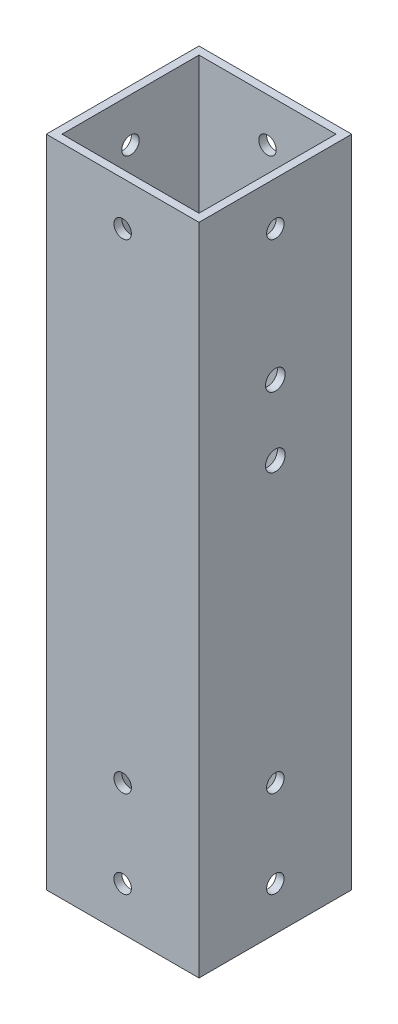
ISO-10303-21;
HEADER;
FILE_DESCRIPTION(('STEP AP214'),'2;1');
FILE_NAME('part.step','',(''),(''),'','','');
FILE_SCHEMA(('AUTOMOTIVE_DESIGN { 1 0 10303 214 1 1 1 1 }'));
ENDSEC;
DATA;
#1=APPLICATION_CONTEXT('core data for automotive mechanical design processes');
#2=APPLICATION_PROTOCOL_DEFINITION('international standard','automotive_design',2000,#1);
#3=PRODUCT_CONTEXT('',#1,'mechanical');
#4=PRODUCT('Part','Part','',(#3));
#5=PRODUCT_RELATED_PRODUCT_CATEGORY('part','',(#4));
#6=PRODUCT_DEFINITION_FORMATION('','',#4);
#7=PRODUCT_DEFINITION_CONTEXT('part definition',#1,'design');
#8=PRODUCT_DEFINITION('design','',#6,#7);
#9=PRODUCT_DEFINITION_SHAPE('','',#8);
#10=(LENGTH_UNIT() NAMED_UNIT(*) SI_UNIT(.MILLI.,.METRE.));
#11=(NAMED_UNIT(*) PLANE_ANGLE_UNIT() SI_UNIT($,.RADIAN.));
#12=(NAMED_UNIT(*) SI_UNIT($,.STERADIAN.) SOLID_ANGLE_UNIT());
#13=UNCERTAINTY_MEASURE_WITH_UNIT(LENGTH_MEASURE(1.E-05),#10,'distance_accuracy_value','');
#14=(GEOMETRIC_REPRESENTATION_CONTEXT(3) GLOBAL_UNCERTAINTY_ASSIGNED_CONTEXT((#13)) GLOBAL_UNIT_ASSIGNED_CONTEXT((#10,
#11,#12)) REPRESENTATION_CONTEXT('',''));
#15=CARTESIAN_POINT('',(0.,0.,0.));
#16=DIRECTION('',(0.,0.,1.));
#17=DIRECTION('',(1.,0.,0.));
#18=AXIS2_PLACEMENT_3D('',#15,#16,#17);
#19=CARTESIAN_POINT('',(-17.5,150.,17.5));
#20=DIRECTION('',(0.,1.,0.));
#21=DIRECTION('',(0.,0.,1.));
#22=AXIS2_PLACEMENT_3D('',#19,#20,#21);
#23=PLANE('',#22);
#24=DIRECTION('',(0.,0.,1.));
#25=VECTOR('',#24,1.);
#26=CARTESIAN_POINT('',(-17.5,150.,-17.5));
#27=LINE('',#26,#25);
#28=CARTESIAN_POINT('',(-17.5,150.,-17.5));
#29=VERTEX_POINT('',#28);
#30=CARTESIAN_POINT('',(-17.5,150.,17.5));
#31=VERTEX_POINT('',#30);
#32=EDGE_CURVE('E137',#29,#31,#27,.T.);
#33=ORIENTED_EDGE('',*,*,#32,.T.);
#34=DIRECTION('',(1.,0.,0.));
#35=VECTOR('',#34,1.);
#36=CARTESIAN_POINT('',(-17.5,150.,17.5));
#37=LINE('',#36,#35);
#38=CARTESIAN_POINT('',(17.5,150.,17.5));
#39=VERTEX_POINT('',#38);
#40=EDGE_CURVE('E140',#31,#39,#37,.T.);
#41=ORIENTED_EDGE('',*,*,#40,.T.);
#42=DIRECTION('',(0.,0.,-1.));
#43=VECTOR('',#42,1.);
#44=CARTESIAN_POINT('',(17.5,150.,-17.5));
#45=LINE('',#44,#43);
#46=CARTESIAN_POINT('',(17.5,150.,-17.5));
#47=VERTEX_POINT('',#46);
#48=EDGE_CURVE('E143',#39,#47,#45,.T.);
#49=ORIENTED_EDGE('',*,*,#48,.T.);
#50=DIRECTION('',(-1.,0.,0.));
#51=VECTOR('',#50,1.);
#52=CARTESIAN_POINT('',(-17.5,150.,-17.5));
#53=LINE('',#52,#51);
#54=EDGE_CURVE('E145',#47,#29,#53,.T.);
#55=ORIENTED_EDGE('',*,*,#54,.T.);
#56=EDGE_LOOP('',(#33,#41,#49,#55));
#57=FACE_BOUND('',#56,.T.);
#58=DIRECTION('',(1.,0.,0.));
#59=VECTOR('',#58,1.);
#60=CARTESIAN_POINT('',(-15.7,150.,15.7));
#61=LINE('',#60,#59);
#62=CARTESIAN_POINT('',(-15.7,150.,15.7));
#63=VERTEX_POINT('',#62);
#64=CARTESIAN_POINT('',(15.7,150.,15.7));
#65=VERTEX_POINT('',#64);
#66=EDGE_CURVE('E107',#63,#65,#61,.T.);
#67=ORIENTED_EDGE('',*,*,#66,.F.);
#68=DIRECTION('',(0.,0.,1.));
#69=VECTOR('',#68,1.);
#70=CARTESIAN_POINT('',(-15.7,150.,-15.7));
#71=LINE('',#70,#69);
#72=CARTESIAN_POINT('',(-15.7,150.,-15.7));
#73=VERTEX_POINT('',#72);
#74=EDGE_CURVE('E99',#73,#63,#71,.T.);
#75=ORIENTED_EDGE('',*,*,#74,.F.);
#76=DIRECTION('',(-1.,0.,0.));
#77=VECTOR('',#76,1.);
#78=CARTESIAN_POINT('',(-15.7,150.,-15.7));
#79=LINE('',#78,#77);
#80=CARTESIAN_POINT('',(15.7,150.,-15.7));
#81=VERTEX_POINT('',#80);
#82=EDGE_CURVE('E121',#81,#73,#79,.T.);
#83=ORIENTED_EDGE('',*,*,#82,.F.);
#84=DIRECTION('',(0.,0.,-1.));
#85=VECTOR('',#84,1.);
#86=CARTESIAN_POINT('',(15.7,150.,-15.7));
#87=LINE('',#86,#85);
#88=EDGE_CURVE('E119',#65,#81,#87,.T.);
#89=ORIENTED_EDGE('',*,*,#88,.F.);
#90=EDGE_LOOP('',(#67,#75,#83,#89));
#91=FACE_BOUND('',#90,.T.);
#92=ADVANCED_FACE('F32',(#57,#91),#23,.T.);
#93=CARTESIAN_POINT('',(-17.5,0.,17.5));
#94=DIRECTION('',(0.,1.,0.));
#95=DIRECTION('',(0.,0.,1.));
#96=AXIS2_PLACEMENT_3D('',#93,#94,#95);
#97=PLANE('',#96);
#98=DIRECTION('',(0.,0.,1.));
#99=VECTOR('',#98,1.);
#100=CARTESIAN_POINT('',(-17.5,0.,-17.5));
#101=LINE('',#100,#99);
#102=CARTESIAN_POINT('',(-17.5,0.,-17.5));
#103=VERTEX_POINT('',#102);
#104=CARTESIAN_POINT('',(-17.5,0.,17.5));
#105=VERTEX_POINT('',#104);
#106=EDGE_CURVE('E115',#103,#105,#101,.T.);
#107=ORIENTED_EDGE('',*,*,#106,.F.);
#108=DIRECTION('',(-1.,0.,0.));
#109=VECTOR('',#108,1.);
#110=CARTESIAN_POINT('',(-17.5,0.,-17.5));
#111=LINE('',#110,#109);
#112=CARTESIAN_POINT('',(17.5,0.,-17.5));
#113=VERTEX_POINT('',#112);
#114=EDGE_CURVE('E141',#113,#103,#111,.T.);
#115=ORIENTED_EDGE('',*,*,#114,.F.);
#116=DIRECTION('',(0.,0.,-1.));
#117=VECTOR('',#116,1.);
#118=CARTESIAN_POINT('',(17.5,0.,-17.5));
#119=LINE('',#118,#117);
#120=CARTESIAN_POINT('',(17.5,0.,17.5));
#121=VERTEX_POINT('',#120);
#122=EDGE_CURVE('E152',#121,#113,#119,.T.);
#123=ORIENTED_EDGE('',*,*,#122,.F.);
#124=DIRECTION('',(1.,0.,0.));
#125=VECTOR('',#124,1.);
#126=CARTESIAN_POINT('',(-17.5,0.,17.5));
#127=LINE('',#126,#125);
#128=EDGE_CURVE('E150',#105,#121,#127,.T.);
#129=ORIENTED_EDGE('',*,*,#128,.F.);
#130=EDGE_LOOP('',(#107,#115,#123,#129));
#131=FACE_BOUND('',#130,.T.);
#132=DIRECTION('',(0.,0.,1.));
#133=VECTOR('',#132,1.);
#134=CARTESIAN_POINT('',(-15.7,0.,-15.7));
#135=LINE('',#134,#133);
#136=CARTESIAN_POINT('',(-15.7,0.,-15.7));
#137=VERTEX_POINT('',#136);
#138=CARTESIAN_POINT('',(-15.7,0.,15.7));
#139=VERTEX_POINT('',#138);
#140=EDGE_CURVE('E57',#137,#139,#135,.T.);
#141=ORIENTED_EDGE('',*,*,#140,.T.);
#142=DIRECTION('',(1.,0.,0.));
#143=VECTOR('',#142,1.);
#144=CARTESIAN_POINT('',(-15.7,0.,15.7));
#145=LINE('',#144,#143);
#146=CARTESIAN_POINT('',(15.7,0.,15.7));
#147=VERTEX_POINT('',#146);
#148=EDGE_CURVE('E114',#139,#147,#145,.T.);
#149=ORIENTED_EDGE('',*,*,#148,.T.);
#150=DIRECTION('',(0.,0.,-1.));
#151=VECTOR('',#150,1.);
#152=CARTESIAN_POINT('',(15.7,0.,-15.7));
#153=LINE('',#152,#151);
#154=CARTESIAN_POINT('',(15.7,0.,-15.7));
#155=VERTEX_POINT('',#154);
#156=EDGE_CURVE('E129',#147,#155,#153,.T.);
#157=ORIENTED_EDGE('',*,*,#156,.T.);
#158=DIRECTION('',(-1.,0.,0.));
#159=VECTOR('',#158,1.);
#160=CARTESIAN_POINT('',(-15.7,0.,-15.7));
#161=LINE('',#160,#159);
#162=EDGE_CURVE('E108',#155,#137,#161,.T.);
#163=ORIENTED_EDGE('',*,*,#162,.T.);
#164=EDGE_LOOP('',(#141,#149,#157,#163));
#165=FACE_BOUND('',#164,.T.);
#166=ADVANCED_FACE('F271',(#131,#165),#97,.F.);
#167=CARTESIAN_POINT('',(-17.5,150.,-17.5));
#168=DIRECTION('',(1.,0.,0.));
#169=DIRECTION('',(0.,0.,-1.));
#170=AXIS2_PLACEMENT_3D('',#167,#168,#169);
#171=PLANE('',#170);
#172=CARTESIAN_POINT('',(-17.5,94.,0.));
#173=DIRECTION('',(1.,0.,0.));
#174=DIRECTION('',(0.,0.,-1.));
#175=AXIS2_PLACEMENT_3D('',#172,#173,#174);
#176=CIRCLE('',#175,2.25);
#177=CARTESIAN_POINT('',(-17.5,94.,-2.25));
#178=VERTEX_POINT('',#177);
#179=EDGE_CURVE('E371',#178,#178,#176,.T.);
#180=ORIENTED_EDGE('',*,*,#179,.T.);
#181=EDGE_LOOP('',(#180));
#182=FACE_BOUND('',#181,.T.);
#183=CARTESIAN_POINT('',(-17.5,110.,0.));
#184=DIRECTION('',(1.,0.,0.));
#185=DIRECTION('',(0.,0.,-1.));
#186=AXIS2_PLACEMENT_3D('',#183,#184,#185);
#187=CIRCLE('',#186,2.25);
#188=CARTESIAN_POINT('',(-17.5,110.,-2.25));
#189=VERTEX_POINT('',#188);
#190=EDGE_CURVE('E193',#189,#189,#187,.T.);
#191=ORIENTED_EDGE('',*,*,#190,.T.);
#192=EDGE_LOOP('',(#191));
#193=FACE_BOUND('',#192,.T.);
#194=CARTESIAN_POINT('',(-17.5,140.,0.));
#195=DIRECTION('',(1.,0.,0.));
#196=DIRECTION('',(0.,0.,-1.));
#197=AXIS2_PLACEMENT_3D('',#194,#195,#196);
#198=CIRCLE('',#197,2.);
#199=CARTESIAN_POINT('',(-17.5,140.,-2.));
#200=VERTEX_POINT('',#199);
#201=EDGE_CURVE('E220',#200,#200,#198,.T.);
#202=ORIENTED_EDGE('',*,*,#201,.T.);
#203=EDGE_LOOP('',(#202));
#204=FACE_BOUND('',#203,.T.);
#205=CARTESIAN_POINT('',(-17.5,30.,0.));
#206=DIRECTION('',(1.,0.,0.));
#207=DIRECTION('',(0.,0.,-1.));
#208=AXIS2_PLACEMENT_3D('',#205,#206,#207);
#209=CIRCLE('',#208,2.);
#210=CARTESIAN_POINT('',(-17.5,30.,-2.));
#211=VERTEX_POINT('',#210);
#212=EDGE_CURVE('E180',#211,#211,#209,.T.);
#213=ORIENTED_EDGE('',*,*,#212,.T.);
#214=EDGE_LOOP('',(#213));
#215=FACE_BOUND('',#214,.T.);
#216=CARTESIAN_POINT('',(-17.5,10.,0.));
#217=DIRECTION('',(1.,0.,0.));
#218=DIRECTION('',(0.,0.,-1.));
#219=AXIS2_PLACEMENT_3D('',#216,#217,#218);
#220=CIRCLE('',#219,2.);
#221=CARTESIAN_POINT('',(-17.5,10.,-2.));
#222=VERTEX_POINT('',#221);
#223=EDGE_CURVE('E175',#222,#222,#220,.T.);
#224=ORIENTED_EDGE('',*,*,#223,.T.);
#225=EDGE_LOOP('',(#224));
#226=FACE_BOUND('',#225,.T.);
#227=ORIENTED_EDGE('',*,*,#106,.T.);
#228=DIRECTION('',(0.,-1.,0.));
#229=VECTOR('',#228,1.);
#230=CARTESIAN_POINT('',(-17.5,150.,17.5));
#231=LINE('',#230,#229);
#232=EDGE_CURVE('E11',#31,#105,#231,.T.);
#233=ORIENTED_EDGE('',*,*,#232,.F.);
#234=ORIENTED_EDGE('',*,*,#32,.F.);
#235=DIRECTION('',(0.,-1.,0.));
#236=VECTOR('',#235,1.);
#237=CARTESIAN_POINT('',(-17.5,150.,-17.5));
#238=LINE('',#237,#236);
#239=EDGE_CURVE('E147',#29,#103,#238,.T.);
#240=ORIENTED_EDGE('',*,*,#239,.T.);
#241=EDGE_LOOP('',(#227,#233,#234,#240));
#242=FACE_BOUND('',#241,.T.);
#243=ADVANCED_FACE('F34',(#182,#193,#204,#215,#226,#242),#171,.F.);
#244=CARTESIAN_POINT('',(-17.5,150.,17.5));
#245=DIRECTION('',(0.,0.,-1.));
#246=DIRECTION('',(-1.,0.,0.));
#247=AXIS2_PLACEMENT_3D('',#244,#245,#246);
#248=PLANE('',#247);
#249=CARTESIAN_POINT('',(0.,140.,17.5));
#250=DIRECTION('',(0.,0.,1.));
#251=DIRECTION('',(1.,0.,0.));
#252=AXIS2_PLACEMENT_3D('',#249,#250,#251);
#253=CIRCLE('',#252,2.);
#254=CARTESIAN_POINT('',(2.,140.,17.5));
#255=VERTEX_POINT('',#254);
#256=EDGE_CURVE('E189',#255,#255,#253,.T.);
#257=ORIENTED_EDGE('',*,*,#256,.F.);
#258=EDGE_LOOP('',(#257));
#259=FACE_BOUND('',#258,.T.);
#260=CARTESIAN_POINT('',(0.,30.,17.5));
#261=DIRECTION('',(0.,0.,1.));
#262=DIRECTION('',(1.,0.,0.));
#263=AXIS2_PLACEMENT_3D('',#260,#261,#262);
#264=CIRCLE('',#263,2.);
#265=CARTESIAN_POINT('',(2.,30.,17.5));
#266=VERTEX_POINT('',#265);
#267=EDGE_CURVE('E237',#266,#266,#264,.T.);
#268=ORIENTED_EDGE('',*,*,#267,.F.);
#269=EDGE_LOOP('',(#268));
#270=FACE_BOUND('',#269,.T.);
#271=CARTESIAN_POINT('',(0.,10.,17.5));
#272=DIRECTION('',(0.,0.,1.));
#273=DIRECTION('',(1.,0.,0.));
#274=AXIS2_PLACEMENT_3D('',#271,#272,#273);
#275=CIRCLE('',#274,2.);
#276=CARTESIAN_POINT('',(2.,10.,17.5));
#277=VERTEX_POINT('',#276);
#278=EDGE_CURVE('E244',#277,#277,#275,.T.);
#279=ORIENTED_EDGE('',*,*,#278,.F.);
#280=EDGE_LOOP('',(#279));
#281=FACE_BOUND('',#280,.T.);
#282=ORIENTED_EDGE('',*,*,#128,.T.);
#283=DIRECTION('',(0.,-1.,0.));
#284=VECTOR('',#283,1.);
#285=CARTESIAN_POINT('',(17.5,150.,17.5));
#286=LINE('',#285,#284);
#287=EDGE_CURVE('E41',#39,#121,#286,.T.);
#288=ORIENTED_EDGE('',*,*,#287,.F.);
#289=ORIENTED_EDGE('',*,*,#40,.F.);
#290=ORIENTED_EDGE('',*,*,#232,.T.);
#291=EDGE_LOOP('',(#282,#288,#289,#290));
#292=FACE_BOUND('',#291,.T.);
#293=ADVANCED_FACE('F285',(#259,#270,#281,#292),#248,.F.);
#294=CARTESIAN_POINT('',(17.5,150.,-17.5));
#295=DIRECTION('',(-1.,0.,0.));
#296=DIRECTION('',(0.,0.,1.));
#297=AXIS2_PLACEMENT_3D('',#294,#295,#296);
#298=PLANE('',#297);
#299=CARTESIAN_POINT('',(17.5,94.,0.));
#300=DIRECTION('',(1.,0.,0.));
#301=DIRECTION('',(0.,0.,-1.));
#302=AXIS2_PLACEMENT_3D('',#299,#300,#301);
#303=CIRCLE('',#302,2.25);
#304=CARTESIAN_POINT('',(17.5,94.,-2.25));
#305=VERTEX_POINT('',#304);
#306=EDGE_CURVE('E370',#305,#305,#303,.T.);
#307=ORIENTED_EDGE('',*,*,#306,.F.);
#308=EDGE_LOOP('',(#307));
#309=FACE_BOUND('',#308,.T.);
#310=CARTESIAN_POINT('',(17.5,110.,0.));
#311=DIRECTION('',(1.,0.,0.));
#312=DIRECTION('',(0.,0.,-1.));
#313=AXIS2_PLACEMENT_3D('',#310,#311,#312);
#314=CIRCLE('',#313,2.25);
#315=CARTESIAN_POINT('',(17.5,110.,-2.25));
#316=VERTEX_POINT('',#315);
#317=EDGE_CURVE('E199',#316,#316,#314,.T.);
#318=ORIENTED_EDGE('',*,*,#317,.F.);
#319=EDGE_LOOP('',(#318));
#320=FACE_BOUND('',#319,.T.);
#321=CARTESIAN_POINT('',(17.5,140.,0.));
#322=DIRECTION('',(1.,0.,0.));
#323=DIRECTION('',(0.,0.,-1.));
#324=AXIS2_PLACEMENT_3D('',#321,#322,#323);
#325=CIRCLE('',#324,2.);
#326=CARTESIAN_POINT('',(17.5,140.,-2.));
#327=VERTEX_POINT('',#326);
#328=EDGE_CURVE('E185',#327,#327,#325,.T.);
#329=ORIENTED_EDGE('',*,*,#328,.F.);
#330=EDGE_LOOP('',(#329));
#331=FACE_BOUND('',#330,.T.);
#332=CARTESIAN_POINT('',(17.5,30.,0.));
#333=DIRECTION('',(1.,0.,0.));
#334=DIRECTION('',(0.,0.,-1.));
#335=AXIS2_PLACEMENT_3D('',#332,#333,#334);
#336=CIRCLE('',#335,2.);
#337=CARTESIAN_POINT('',(17.5,30.,-2.));
#338=VERTEX_POINT('',#337);
#339=EDGE_CURVE('E223',#338,#338,#336,.T.);
#340=ORIENTED_EDGE('',*,*,#339,.F.);
#341=EDGE_LOOP('',(#340));
#342=FACE_BOUND('',#341,.T.);
#343=CARTESIAN_POINT('',(17.5,10.,0.));
#344=DIRECTION('',(1.,0.,0.));
#345=DIRECTION('',(0.,0.,-1.));
#346=AXIS2_PLACEMENT_3D('',#343,#344,#345);
#347=CIRCLE('',#346,2.);
#348=CARTESIAN_POINT('',(17.5,10.,-2.));
#349=VERTEX_POINT('',#348);
#350=EDGE_CURVE('E230',#349,#349,#347,.T.);
#351=ORIENTED_EDGE('',*,*,#350,.F.);
#352=EDGE_LOOP('',(#351));
#353=FACE_BOUND('',#352,.T.);
#354=ORIENTED_EDGE('',*,*,#122,.T.);
#355=DIRECTION('',(0.,-1.,0.));
#356=VECTOR('',#355,1.);
#357=CARTESIAN_POINT('',(17.5,150.,-17.5));
#358=LINE('',#357,#356);
#359=EDGE_CURVE('E157',#47,#113,#358,.T.);
#360=ORIENTED_EDGE('',*,*,#359,.F.);
#361=ORIENTED_EDGE('',*,*,#48,.F.);
#362=ORIENTED_EDGE('',*,*,#287,.T.);
#363=EDGE_LOOP('',(#354,#360,#361,#362));
#364=FACE_BOUND('',#363,.T.);
#365=ADVANCED_FACE('F282',(#309,#320,#331,#342,#353,#364),#298,.F.);
#366=CARTESIAN_POINT('',(-17.5,150.,-17.5));
#367=DIRECTION('',(0.,0.,1.));
#368=DIRECTION('',(1.,0.,0.));
#369=AXIS2_PLACEMENT_3D('',#366,#367,#368);
#370=PLANE('',#369);
#371=CARTESIAN_POINT('',(0.,140.,-17.5));
#372=DIRECTION('',(0.,0.,1.));
#373=DIRECTION('',(1.,0.,0.));
#374=AXIS2_PLACEMENT_3D('',#371,#372,#373);
#375=CIRCLE('',#374,2.);
#376=CARTESIAN_POINT('',(2.,140.,-17.5));
#377=VERTEX_POINT('',#376);
#378=EDGE_CURVE('E213',#377,#377,#375,.T.);
#379=ORIENTED_EDGE('',*,*,#378,.T.);
#380=EDGE_LOOP('',(#379));
#381=FACE_BOUND('',#380,.T.);
#382=CARTESIAN_POINT('',(0.,30.,-17.5));
#383=DIRECTION('',(0.,0.,1.));
#384=DIRECTION('',(1.,0.,0.));
#385=AXIS2_PLACEMENT_3D('',#382,#383,#384);
#386=CIRCLE('',#385,2.);
#387=CARTESIAN_POINT('',(2.,30.,-17.5));
#388=VERTEX_POINT('',#387);
#389=EDGE_CURVE('E170',#388,#388,#386,.T.);
#390=ORIENTED_EDGE('',*,*,#389,.T.);
#391=EDGE_LOOP('',(#390));
#392=FACE_BOUND('',#391,.T.);
#393=CARTESIAN_POINT('',(0.,10.,-17.5));
#394=DIRECTION('',(0.,0.,1.));
#395=DIRECTION('',(1.,0.,0.));
#396=AXIS2_PLACEMENT_3D('',#393,#394,#395);
#397=CIRCLE('',#396,2.);
#398=CARTESIAN_POINT('',(2.,10.,-17.5));
#399=VERTEX_POINT('',#398);
#400=EDGE_CURVE('E165',#399,#399,#397,.T.);
#401=ORIENTED_EDGE('',*,*,#400,.T.);
#402=EDGE_LOOP('',(#401));
#403=FACE_BOUND('',#402,.T.);
#404=ORIENTED_EDGE('',*,*,#114,.T.);
#405=ORIENTED_EDGE('',*,*,#239,.F.);
#406=ORIENTED_EDGE('',*,*,#54,.F.);
#407=ORIENTED_EDGE('',*,*,#359,.T.);
#408=EDGE_LOOP('',(#404,#405,#406,#407));
#409=FACE_BOUND('',#408,.T.);
#410=ADVANCED_FACE('F265',(#381,#392,#403,#409),#370,.F.);
#411=CARTESIAN_POINT('',(-15.7,150.,-15.7));
#412=DIRECTION('',(1.,0.,0.));
#413=DIRECTION('',(0.,0.,-1.));
#414=AXIS2_PLACEMENT_3D('',#411,#412,#413);
#415=PLANE('',#414);
#416=CARTESIAN_POINT('',(-15.7,94.,0.));
#417=DIRECTION('',(1.,0.,0.));
#418=DIRECTION('',(0.,0.,-1.));
#419=AXIS2_PLACEMENT_3D('',#416,#417,#418);
#420=CIRCLE('',#419,2.25);
#421=CARTESIAN_POINT('',(-15.7,94.,-2.25));
#422=VERTEX_POINT('',#421);
#423=EDGE_CURVE('E204',#422,#422,#420,.T.);
#424=ORIENTED_EDGE('',*,*,#423,.F.);
#425=EDGE_LOOP('',(#424));
#426=FACE_BOUND('',#425,.T.);
#427=CARTESIAN_POINT('',(-15.7,110.,0.));
#428=DIRECTION('',(1.,0.,0.));
#429=DIRECTION('',(0.,0.,-1.));
#430=AXIS2_PLACEMENT_3D('',#427,#428,#429);
#431=CIRCLE('',#430,2.25);
#432=CARTESIAN_POINT('',(-15.7,110.,-2.25));
#433=VERTEX_POINT('',#432);
#434=EDGE_CURVE('E192',#433,#433,#431,.T.);
#435=ORIENTED_EDGE('',*,*,#434,.F.);
#436=EDGE_LOOP('',(#435));
#437=FACE_BOUND('',#436,.T.);
#438=CARTESIAN_POINT('',(-15.7,140.,0.));
#439=DIRECTION('',(1.,0.,0.));
#440=DIRECTION('',(0.,0.,-1.));
#441=AXIS2_PLACEMENT_3D('',#438,#439,#440);
#442=CIRCLE('',#441,2.);
#443=CARTESIAN_POINT('',(-15.7,140.,-2.));
#444=VERTEX_POINT('',#443);
#445=EDGE_CURVE('E184',#444,#444,#442,.T.);
#446=ORIENTED_EDGE('',*,*,#445,.F.);
#447=EDGE_LOOP('',(#446));
#448=FACE_BOUND('',#447,.T.);
#449=CARTESIAN_POINT('',(-15.7,30.,0.));
#450=DIRECTION('',(1.,0.,0.));
#451=DIRECTION('',(0.,0.,-1.));
#452=AXIS2_PLACEMENT_3D('',#449,#450,#451);
#453=CIRCLE('',#452,2.);
#454=CARTESIAN_POINT('',(-15.7,30.,-2.));
#455=VERTEX_POINT('',#454);
#456=EDGE_CURVE('E179',#455,#455,#453,.T.);
#457=ORIENTED_EDGE('',*,*,#456,.F.);
#458=EDGE_LOOP('',(#457));
#459=FACE_BOUND('',#458,.T.);
#460=CARTESIAN_POINT('',(-15.7,10.,0.));
#461=DIRECTION('',(1.,0.,0.));
#462=DIRECTION('',(0.,0.,-1.));
#463=AXIS2_PLACEMENT_3D('',#460,#461,#462);
#464=CIRCLE('',#463,2.);
#465=CARTESIAN_POINT('',(-15.7,10.,-2.));
#466=VERTEX_POINT('',#465);
#467=EDGE_CURVE('E174',#466,#466,#464,.T.);
#468=ORIENTED_EDGE('',*,*,#467,.F.);
#469=EDGE_LOOP('',(#468));
#470=FACE_BOUND('',#469,.T.);
#471=ORIENTED_EDGE('',*,*,#140,.F.);
#472=DIRECTION('',(0.,-1.,0.));
#473=VECTOR('',#472,1.);
#474=CARTESIAN_POINT('',(-15.7,150.,-15.7));
#475=LINE('',#474,#473);
#476=EDGE_CURVE('E103',#73,#137,#475,.T.);
#477=ORIENTED_EDGE('',*,*,#476,.F.);
#478=ORIENTED_EDGE('',*,*,#74,.T.);
#479=DIRECTION('',(0.,-1.,0.));
#480=VECTOR('',#479,1.);
#481=CARTESIAN_POINT('',(-15.7,150.,15.7));
#482=LINE('',#481,#480);
#483=EDGE_CURVE('E102',#63,#139,#482,.T.);
#484=ORIENTED_EDGE('',*,*,#483,.T.);
#485=EDGE_LOOP('',(#471,#477,#478,#484));
#486=FACE_BOUND('',#485,.T.);
#487=ADVANCED_FACE('F101',(#426,#437,#448,#459,#470,#486),#415,.T.);
#488=CARTESIAN_POINT('',(-15.7,150.,15.7));
#489=DIRECTION('',(0.,0.,-1.));
#490=DIRECTION('',(-1.,0.,0.));
#491=AXIS2_PLACEMENT_3D('',#488,#489,#490);
#492=PLANE('',#491);
#493=CARTESIAN_POINT('',(0.,140.,15.7));
#494=DIRECTION('',(0.,0.,-1.));
#495=DIRECTION('',(-1.,0.,0.));
#496=AXIS2_PLACEMENT_3D('',#493,#494,#495);
#497=CIRCLE('',#496,2.);
#498=CARTESIAN_POINT('',(-2.,140.,15.7));
#499=VERTEX_POINT('',#498);
#500=EDGE_CURVE('E188',#499,#499,#497,.T.);
#501=ORIENTED_EDGE('',*,*,#500,.F.);
#502=EDGE_LOOP('',(#501));
#503=FACE_BOUND('',#502,.T.);
#504=CARTESIAN_POINT('',(0.,30.,15.7));
#505=DIRECTION('',(0.,0.,-1.));
#506=DIRECTION('',(-1.,0.,0.));
#507=AXIS2_PLACEMENT_3D('',#504,#505,#506);
#508=CIRCLE('',#507,2.);
#509=CARTESIAN_POINT('',(-2.,30.,15.7));
#510=VERTEX_POINT('',#509);
#511=EDGE_CURVE('E169',#510,#510,#508,.T.);
#512=ORIENTED_EDGE('',*,*,#511,.F.);
#513=EDGE_LOOP('',(#512));
#514=FACE_BOUND('',#513,.T.);
#515=CARTESIAN_POINT('',(0.,10.,15.7));
#516=DIRECTION('',(0.,0.,-1.));
#517=DIRECTION('',(-1.,0.,0.));
#518=AXIS2_PLACEMENT_3D('',#515,#516,#517);
#519=CIRCLE('',#518,2.);
#520=CARTESIAN_POINT('',(-2.,10.,15.7));
#521=VERTEX_POINT('',#520);
#522=EDGE_CURVE('E127',#521,#521,#519,.T.);
#523=ORIENTED_EDGE('',*,*,#522,.F.);
#524=EDGE_LOOP('',(#523));
#525=FACE_BOUND('',#524,.T.);
#526=ORIENTED_EDGE('',*,*,#148,.F.);
#527=ORIENTED_EDGE('',*,*,#483,.F.);
#528=ORIENTED_EDGE('',*,*,#66,.T.);
#529=DIRECTION('',(0.,-1.,0.));
#530=VECTOR('',#529,1.);
#531=CARTESIAN_POINT('',(15.7,150.,15.7));
#532=LINE('',#531,#530);
#533=EDGE_CURVE('E116',#65,#147,#532,.T.);
#534=ORIENTED_EDGE('',*,*,#533,.T.);
#535=EDGE_LOOP('',(#526,#527,#528,#534));
#536=FACE_BOUND('',#535,.T.);
#537=ADVANCED_FACE('F111',(#503,#514,#525,#536),#492,.T.);
#538=CARTESIAN_POINT('',(15.7,150.,-15.7));
#539=DIRECTION('',(-1.,0.,0.));
#540=DIRECTION('',(0.,0.,1.));
#541=AXIS2_PLACEMENT_3D('',#538,#539,#540);
#542=PLANE('',#541);
#543=CARTESIAN_POINT('',(15.7,94.,0.));
#544=DIRECTION('',(-1.,0.,0.));
#545=DIRECTION('',(0.,0.,1.));
#546=AXIS2_PLACEMENT_3D('',#543,#544,#545);
#547=CIRCLE('',#546,2.25);
#548=CARTESIAN_POINT('',(15.7,94.,2.25));
#549=VERTEX_POINT('',#548);
#550=EDGE_CURVE('E36',#549,#549,#547,.T.);
#551=ORIENTED_EDGE('',*,*,#550,.F.);
#552=EDGE_LOOP('',(#551));
#553=FACE_BOUND('',#552,.T.);
#554=CARTESIAN_POINT('',(15.7,110.,0.));
#555=DIRECTION('',(-1.,0.,0.));
#556=DIRECTION('',(0.,0.,1.));
#557=AXIS2_PLACEMENT_3D('',#554,#555,#556);
#558=CIRCLE('',#557,2.25);
#559=CARTESIAN_POINT('',(15.7,110.,2.25));
#560=VERTEX_POINT('',#559);
#561=EDGE_CURVE('E190',#560,#560,#558,.T.);
#562=ORIENTED_EDGE('',*,*,#561,.F.);
#563=EDGE_LOOP('',(#562));
#564=FACE_BOUND('',#563,.T.);
#565=CARTESIAN_POINT('',(15.7,140.,0.));
#566=DIRECTION('',(-1.,0.,0.));
#567=DIRECTION('',(0.,0.,1.));
#568=AXIS2_PLACEMENT_3D('',#565,#566,#567);
#569=CIRCLE('',#568,2.);
#570=CARTESIAN_POINT('',(15.7,140.,2.));
#571=VERTEX_POINT('',#570);
#572=EDGE_CURVE('E181',#571,#571,#569,.T.);
#573=ORIENTED_EDGE('',*,*,#572,.F.);
#574=EDGE_LOOP('',(#573));
#575=FACE_BOUND('',#574,.T.);
#576=CARTESIAN_POINT('',(15.7,30.,0.));
#577=DIRECTION('',(-1.,0.,0.));
#578=DIRECTION('',(0.,0.,1.));
#579=AXIS2_PLACEMENT_3D('',#576,#577,#578);
#580=CIRCLE('',#579,2.);
#581=CARTESIAN_POINT('',(15.7,30.,2.));
#582=VERTEX_POINT('',#581);
#583=EDGE_CURVE('E176',#582,#582,#580,.T.);
#584=ORIENTED_EDGE('',*,*,#583,.F.);
#585=EDGE_LOOP('',(#584));
#586=FACE_BOUND('',#585,.T.);
#587=CARTESIAN_POINT('',(15.7,10.,0.));
#588=DIRECTION('',(-1.,0.,0.));
#589=DIRECTION('',(0.,0.,1.));
#590=AXIS2_PLACEMENT_3D('',#587,#588,#589);
#591=CIRCLE('',#590,2.);
#592=CARTESIAN_POINT('',(15.7,10.,2.));
#593=VERTEX_POINT('',#592);
#594=EDGE_CURVE('E171',#593,#593,#591,.T.);
#595=ORIENTED_EDGE('',*,*,#594,.F.);
#596=EDGE_LOOP('',(#595));
#597=FACE_BOUND('',#596,.T.);
#598=ORIENTED_EDGE('',*,*,#156,.F.);
#599=ORIENTED_EDGE('',*,*,#533,.F.);
#600=ORIENTED_EDGE('',*,*,#88,.T.);
#601=DIRECTION('',(0.,-1.,0.));
#602=VECTOR('',#601,1.);
#603=CARTESIAN_POINT('',(15.7,150.,-15.7));
#604=LINE('',#603,#602);
#605=EDGE_CURVE('E49',#81,#155,#604,.T.);
#606=ORIENTED_EDGE('',*,*,#605,.T.);
#607=EDGE_LOOP('',(#598,#599,#600,#606));
#608=FACE_BOUND('',#607,.T.);
#609=ADVANCED_FACE('F255',(#553,#564,#575,#586,#597,#608),#542,.T.);
#610=CARTESIAN_POINT('',(-15.7,150.,-15.7));
#611=DIRECTION('',(0.,0.,1.));
#612=DIRECTION('',(1.,0.,0.));
#613=AXIS2_PLACEMENT_3D('',#610,#611,#612);
#614=PLANE('',#613);
#615=CARTESIAN_POINT('',(0.,140.,-15.7));
#616=DIRECTION('',(0.,0.,1.));
#617=DIRECTION('',(1.,0.,0.));
#618=AXIS2_PLACEMENT_3D('',#615,#616,#617);
#619=CIRCLE('',#618,2.);
#620=CARTESIAN_POINT('',(2.,140.,-15.7));
#621=VERTEX_POINT('',#620);
#622=EDGE_CURVE('E186',#621,#621,#619,.T.);
#623=ORIENTED_EDGE('',*,*,#622,.F.);
#624=EDGE_LOOP('',(#623));
#625=FACE_BOUND('',#624,.T.);
#626=CARTESIAN_POINT('',(0.,30.,-15.7));
#627=DIRECTION('',(0.,0.,1.));
#628=DIRECTION('',(1.,0.,0.));
#629=AXIS2_PLACEMENT_3D('',#626,#627,#628);
#630=CIRCLE('',#629,2.);
#631=CARTESIAN_POINT('',(2.,30.,-15.7));
#632=VERTEX_POINT('',#631);
#633=EDGE_CURVE('E166',#632,#632,#630,.T.);
#634=ORIENTED_EDGE('',*,*,#633,.F.);
#635=EDGE_LOOP('',(#634));
#636=FACE_BOUND('',#635,.T.);
#637=CARTESIAN_POINT('',(0.,10.,-15.7));
#638=DIRECTION('',(0.,0.,1.));
#639=DIRECTION('',(1.,0.,0.));
#640=AXIS2_PLACEMENT_3D('',#637,#638,#639);
#641=CIRCLE('',#640,2.);
#642=CARTESIAN_POINT('',(2.,10.,-15.7));
#643=VERTEX_POINT('',#642);
#644=EDGE_CURVE('E162',#643,#643,#641,.T.);
#645=ORIENTED_EDGE('',*,*,#644,.F.);
#646=EDGE_LOOP('',(#645));
#647=FACE_BOUND('',#646,.T.);
#648=ORIENTED_EDGE('',*,*,#162,.F.);
#649=ORIENTED_EDGE('',*,*,#605,.F.);
#650=ORIENTED_EDGE('',*,*,#82,.T.);
#651=ORIENTED_EDGE('',*,*,#476,.T.);
#652=EDGE_LOOP('',(#648,#649,#650,#651));
#653=FACE_BOUND('',#652,.T.);
#654=ADVANCED_FACE('F262',(#625,#636,#647,#653),#614,.T.);
#655=CARTESIAN_POINT('',(0.,10.,-17.5));
#656=DIRECTION('',(0.,0.,1.));
#657=DIRECTION('',(1.,0.,0.));
#658=AXIS2_PLACEMENT_3D('',#655,#656,#657);
#659=CYLINDRICAL_SURFACE('',#658,2.);
#660=ORIENTED_EDGE('',*,*,#644,.T.);
#661=EDGE_LOOP('',(#660));
#662=FACE_BOUND('',#661,.T.);
#663=ORIENTED_EDGE('',*,*,#400,.F.);
#664=EDGE_LOOP('',(#663));
#665=FACE_BOUND('',#664,.T.);
#666=ADVANCED_FACE('F315',(#662,#665),#659,.F.);
#667=ORIENTED_EDGE('',*,*,#522,.T.);
#668=EDGE_LOOP('',(#667));
#669=FACE_BOUND('',#668,.T.);
#670=ORIENTED_EDGE('',*,*,#278,.T.);
#671=EDGE_LOOP('',(#670));
#672=FACE_BOUND('',#671,.T.);
#673=ADVANCED_FACE('F251',(#669,#672),#659,.F.);
#674=CARTESIAN_POINT('',(0.,30.,-17.5));
#675=DIRECTION('',(0.,0.,1.));
#676=DIRECTION('',(1.,0.,0.));
#677=AXIS2_PLACEMENT_3D('',#674,#675,#676);
#678=CYLINDRICAL_SURFACE('',#677,2.);
#679=ORIENTED_EDGE('',*,*,#633,.T.);
#680=EDGE_LOOP('',(#679));
#681=FACE_BOUND('',#680,.T.);
#682=ORIENTED_EDGE('',*,*,#389,.F.);
#683=EDGE_LOOP('',(#682));
#684=FACE_BOUND('',#683,.T.);
#685=ADVANCED_FACE('F326',(#681,#684),#678,.F.);
#686=ORIENTED_EDGE('',*,*,#511,.T.);
#687=EDGE_LOOP('',(#686));
#688=FACE_BOUND('',#687,.T.);
#689=ORIENTED_EDGE('',*,*,#267,.T.);
#690=EDGE_LOOP('',(#689));
#691=FACE_BOUND('',#690,.T.);
#692=ADVANCED_FACE('F329',(#688,#691),#678,.F.);
#693=CARTESIAN_POINT('',(-17.5,10.,0.));
#694=DIRECTION('',(1.,0.,0.));
#695=DIRECTION('',(0.,0.,-1.));
#696=AXIS2_PLACEMENT_3D('',#693,#694,#695);
#697=CYLINDRICAL_SURFACE('',#696,2.);
#698=ORIENTED_EDGE('',*,*,#594,.T.);
#699=EDGE_LOOP('',(#698));
#700=FACE_BOUND('',#699,.T.);
#701=ORIENTED_EDGE('',*,*,#350,.T.);
#702=EDGE_LOOP('',(#701));
#703=FACE_BOUND('',#702,.T.);
#704=ADVANCED_FACE('F331',(#700,#703),#697,.F.);
#705=ORIENTED_EDGE('',*,*,#467,.T.);
#706=EDGE_LOOP('',(#705));
#707=FACE_BOUND('',#706,.T.);
#708=ORIENTED_EDGE('',*,*,#223,.F.);
#709=EDGE_LOOP('',(#708));
#710=FACE_BOUND('',#709,.T.);
#711=ADVANCED_FACE('F334',(#707,#710),#697,.F.);
#712=CARTESIAN_POINT('',(-17.5,30.,0.));
#713=DIRECTION('',(1.,0.,0.));
#714=DIRECTION('',(0.,0.,-1.));
#715=AXIS2_PLACEMENT_3D('',#712,#713,#714);
#716=CYLINDRICAL_SURFACE('',#715,2.);
#717=ORIENTED_EDGE('',*,*,#583,.T.);
#718=EDGE_LOOP('',(#717));
#719=FACE_BOUND('',#718,.T.);
#720=ORIENTED_EDGE('',*,*,#339,.T.);
#721=EDGE_LOOP('',(#720));
#722=FACE_BOUND('',#721,.T.);
#723=ADVANCED_FACE('F336',(#719,#722),#716,.F.);
#724=ORIENTED_EDGE('',*,*,#456,.T.);
#725=EDGE_LOOP('',(#724));
#726=FACE_BOUND('',#725,.T.);
#727=ORIENTED_EDGE('',*,*,#212,.F.);
#728=EDGE_LOOP('',(#727));
#729=FACE_BOUND('',#728,.T.);
#730=ADVANCED_FACE('F339',(#726,#729),#716,.F.);
#731=CARTESIAN_POINT('',(-22.5,140.,0.));
#732=DIRECTION('',(1.,0.,0.));
#733=DIRECTION('',(0.,0.,-1.));
#734=AXIS2_PLACEMENT_3D('',#731,#732,#733);
#735=CYLINDRICAL_SURFACE('',#734,2.);
#736=ORIENTED_EDGE('',*,*,#572,.T.);
#737=EDGE_LOOP('',(#736));
#738=FACE_BOUND('',#737,.T.);
#739=ORIENTED_EDGE('',*,*,#328,.T.);
#740=EDGE_LOOP('',(#739));
#741=FACE_BOUND('',#740,.T.);
#742=ADVANCED_FACE('F341',(#738,#741),#735,.F.);
#743=ORIENTED_EDGE('',*,*,#445,.T.);
#744=EDGE_LOOP('',(#743));
#745=FACE_BOUND('',#744,.T.);
#746=ORIENTED_EDGE('',*,*,#201,.F.);
#747=EDGE_LOOP('',(#746));
#748=FACE_BOUND('',#747,.T.);
#749=ADVANCED_FACE('F344',(#745,#748),#735,.F.);
#750=CARTESIAN_POINT('',(0.,140.,-22.5));
#751=DIRECTION('',(0.,0.,1.));
#752=DIRECTION('',(1.,0.,0.));
#753=AXIS2_PLACEMENT_3D('',#750,#751,#752);
#754=CYLINDRICAL_SURFACE('',#753,2.);
#755=ORIENTED_EDGE('',*,*,#622,.T.);
#756=EDGE_LOOP('',(#755));
#757=FACE_BOUND('',#756,.T.);
#758=ORIENTED_EDGE('',*,*,#378,.F.);
#759=EDGE_LOOP('',(#758));
#760=FACE_BOUND('',#759,.T.);
#761=ADVANCED_FACE('F346',(#757,#760),#754,.F.);
#762=ORIENTED_EDGE('',*,*,#500,.T.);
#763=EDGE_LOOP('',(#762));
#764=FACE_BOUND('',#763,.T.);
#765=ORIENTED_EDGE('',*,*,#256,.T.);
#766=EDGE_LOOP('',(#765));
#767=FACE_BOUND('',#766,.T.);
#768=ADVANCED_FACE('F349',(#764,#767),#754,.F.);
#769=CARTESIAN_POINT('',(-17.5,110.,0.));
#770=DIRECTION('',(1.,0.,0.));
#771=DIRECTION('',(0.,0.,-1.));
#772=AXIS2_PLACEMENT_3D('',#769,#770,#771);
#773=CYLINDRICAL_SURFACE('',#772,2.25);
#774=ORIENTED_EDGE('',*,*,#561,.T.);
#775=EDGE_LOOP('',(#774));
#776=FACE_BOUND('',#775,.T.);
#777=ORIENTED_EDGE('',*,*,#317,.T.);
#778=EDGE_LOOP('',(#777));
#779=FACE_BOUND('',#778,.T.);
#780=ADVANCED_FACE('F351',(#776,#779),#773,.F.);
#781=ORIENTED_EDGE('',*,*,#434,.T.);
#782=EDGE_LOOP('',(#781));
#783=FACE_BOUND('',#782,.T.);
#784=ORIENTED_EDGE('',*,*,#190,.F.);
#785=EDGE_LOOP('',(#784));
#786=FACE_BOUND('',#785,.T.);
#787=ADVANCED_FACE('F354',(#783,#786),#773,.F.);
#788=CARTESIAN_POINT('',(-17.5,94.,0.));
#789=DIRECTION('',(1.,0.,0.));
#790=DIRECTION('',(0.,0.,-1.));
#791=AXIS2_PLACEMENT_3D('',#788,#789,#790);
#792=CYLINDRICAL_SURFACE('',#791,2.25);
#793=ORIENTED_EDGE('',*,*,#550,.T.);
#794=EDGE_LOOP('',(#793));
#795=FACE_BOUND('',#794,.T.);
#796=ORIENTED_EDGE('',*,*,#306,.T.);
#797=EDGE_LOOP('',(#796));
#798=FACE_BOUND('',#797,.T.);
#799=ADVANCED_FACE('F355',(#795,#798),#792,.F.);
#800=ORIENTED_EDGE('',*,*,#423,.T.);
#801=EDGE_LOOP('',(#800));
#802=FACE_BOUND('',#801,.T.);
#803=ORIENTED_EDGE('',*,*,#179,.F.);
#804=EDGE_LOOP('',(#803));
#805=FACE_BOUND('',#804,.T.);
#806=ADVANCED_FACE('F357',(#802,#805),#792,.F.);
#807=CLOSED_SHELL('',(#92,#166,#243,#293,#365,#410,#487,#537,#609,#654,#666,#673,#685,#692,#704,
#711,#723,#730,#742,#749,#761,#768,#780,#787,#799,#806));
#808=MANIFOLD_SOLID_BREP('B2',#807);
#809=ADVANCED_BREP_SHAPE_REPRESENTATION('',(#18,#808),#14);
#810=SHAPE_DEFINITION_REPRESENTATION(#9,#809);
ENDSEC;
END-ISO-10303-21;
